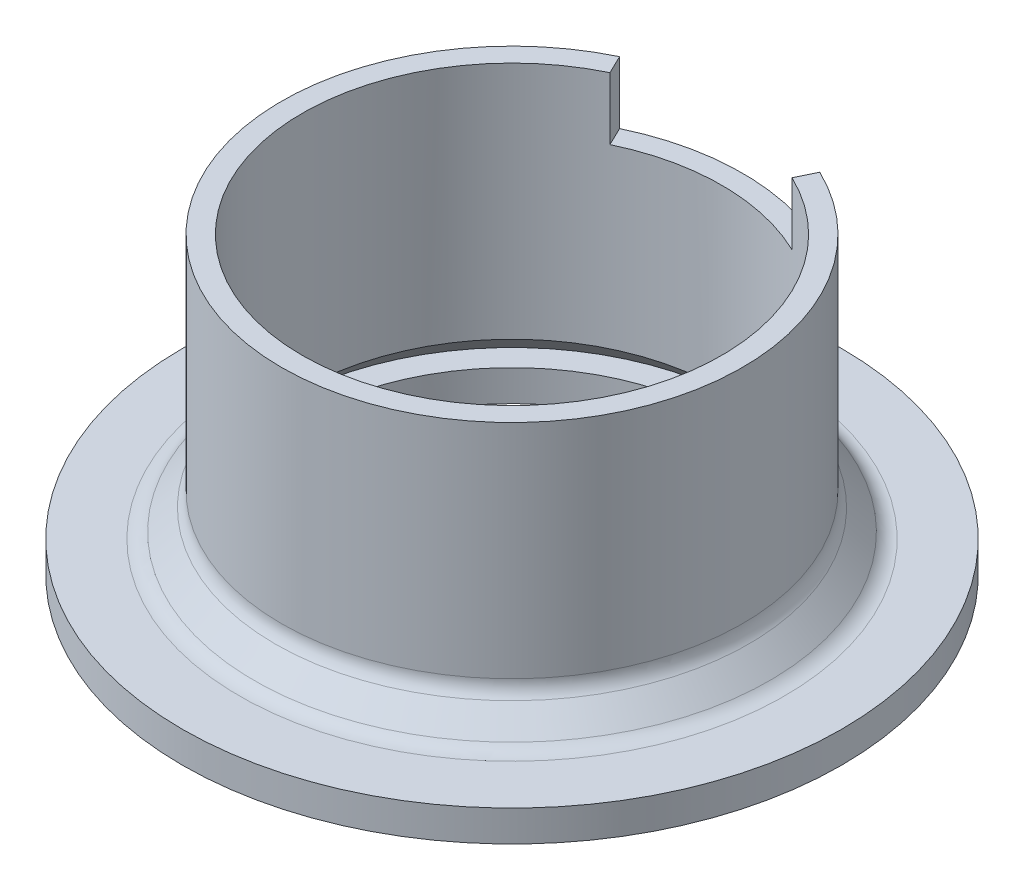
ISO-10303-21;
HEADER;
FILE_DESCRIPTION(('STEP AP214'),'2;1');
FILE_NAME('part.step','',(''),(''),'','','');
FILE_SCHEMA(('AUTOMOTIVE_DESIGN { 1 0 10303 214 1 1 1 1 }'));
ENDSEC;
DATA;
#1=APPLICATION_CONTEXT('core data for automotive mechanical design processes');
#2=APPLICATION_PROTOCOL_DEFINITION('international standard','automotive_design',2000,#1);
#3=PRODUCT_CONTEXT('',#1,'mechanical');
#4=PRODUCT('Part','Part','',(#3));
#5=PRODUCT_RELATED_PRODUCT_CATEGORY('part','',(#4));
#6=PRODUCT_DEFINITION_FORMATION('','',#4);
#7=PRODUCT_DEFINITION_CONTEXT('part definition',#1,'design');
#8=PRODUCT_DEFINITION('design','',#6,#7);
#9=PRODUCT_DEFINITION_SHAPE('','',#8);
#10=(LENGTH_UNIT() NAMED_UNIT(*) SI_UNIT(.MILLI.,.METRE.));
#11=(NAMED_UNIT(*) PLANE_ANGLE_UNIT() SI_UNIT($,.RADIAN.));
#12=(NAMED_UNIT(*) SI_UNIT($,.STERADIAN.) SOLID_ANGLE_UNIT());
#13=UNCERTAINTY_MEASURE_WITH_UNIT(LENGTH_MEASURE(1.E-05),#10,'distance_accuracy_value','');
#14=(GEOMETRIC_REPRESENTATION_CONTEXT(3) GLOBAL_UNCERTAINTY_ASSIGNED_CONTEXT((#13)) GLOBAL_UNIT_ASSIGNED_CONTEXT((#10,
#11,#12)) REPRESENTATION_CONTEXT('',''));
#15=CARTESIAN_POINT('',(0.,0.,0.));
#16=DIRECTION('',(0.,0.,1.));
#17=DIRECTION('',(1.,0.,0.));
#18=AXIS2_PLACEMENT_3D('',#15,#16,#17);
#19=CARTESIAN_POINT('',(0.,0.,0.));
#20=DIRECTION('',(0.,-1.,0.));
#21=DIRECTION('',(0.,0.,-1.));
#22=AXIS2_PLACEMENT_3D('',#19,#20,#21);
#23=CONICAL_SURFACE('',#22,22.5715728752538,0.785398163397448);
#24=CARTESIAN_POINT('',(0.,0.,0.));
#25=DIRECTION('',(0.,1.,0.));
#26=DIRECTION('',(0.,0.,1.));
#27=AXIS2_PLACEMENT_3D('',#24,#25,#26);
#28=CIRCLE('',#27,22.5715728752538);
#29=CARTESIAN_POINT('',(1.00000000000024,0.,22.5494102375848));
#30=VERTEX_POINT('',#29);
#31=CARTESIAN_POINT('',(22.5494102375848,0.,1.));
#32=VERTEX_POINT('',#31);
#33=EDGE_CURVE('E210',#30,#32,#28,.T.);
#34=ORIENTED_EDGE('',*,*,#33,.F.);
#35=CARTESIAN_POINT('',(1.00000000000027,-3.0926493253987,25.644732425285));
#36=CARTESIAN_POINT('',(1.00000000000026,-2.38144524293219,24.9329862035659));
#37=CARTESIAN_POINT('',(1.00000000000025,-1.67026202271059,24.2212191333853));
#38=CARTESIAN_POINT('',(1.00000000000024,-0.247954460315439,22.7976261871441));
#39=CARTESIAN_POINT('',(1.00000000000023,0.463169881858879,22.0858003110842));
#40=CARTESIAN_POINT('',(1.00000000000022,1.88534255816285,20.6620726205477));
#41=CARTESIAN_POINT('',(1.00000000000021,2.59639089229196,19.9501708060707));
#42=CARTESIAN_POINT('',(1.00000000000019,4.01837974852563,18.5262594934386));
#43=CARTESIAN_POINT('',(1.00000000000019,4.72932027062876,17.8142499952823));
#44=CARTESIAN_POINT('',(1.00000000000018,5.44019097783295,17.10217078956));
#45=B_SPLINE_CURVE_WITH_KNOTS('',3,(#35,#36,#37,#38,#39,#40,#41,#42,#43,#44),.UNSPECIFIED.,.F.,
.F.,(4,2,2,2,4),(0.,3.01853364877657,6.03706725821883,9.05560088899381,12.0741345597101),.UNSPECIFIED.);
#46=CARTESIAN_POINT('',(1.00000000000021,2.34683554692244,20.2));
#47=VERTEX_POINT('',#46);
#48=EDGE_CURVE('E462',#30,#47,#45,.T.);
#49=ORIENTED_EDGE('',*,*,#48,.T.);
#50=CARTESIAN_POINT('',(-6.5069413407723,1.34940791471657,20.2000000000001));
#51=CARTESIAN_POINT('',(-6.27177744659428,1.42151188061224,20.2000000000001));
#52=CARTESIAN_POINT('',(-6.035627758326,1.49037548259756,20.2000000000001));
#53=CARTESIAN_POINT('',(-5.56140065408711,1.62122178355149,20.2000000000001));
#54=CARTESIAN_POINT('',(-5.32332300692677,1.68320364378869,20.2000000000001));
#55=CARTESIAN_POINT('',(-4.60601502671594,1.85828278435188,20.2));
#56=CARTESIAN_POINT('',(-4.12403971023993,1.96041133415662,20.2));
#57=CARTESIAN_POINT('',(-3.16355454162542,2.1307071040694,20.2));
#58=CARTESIAN_POINT('',(-2.68515289396587,2.19948283286201,20.2));
#59=CARTESIAN_POINT('',(-1.72487503342651,2.30367834314739,20.2));
#60=CARTESIAN_POINT('',(-1.24300024462189,2.33911109036389,20.2));
#61=CARTESIAN_POINT('',(-0.277385611884381,2.37543620653485,20.2));
#62=CARTESIAN_POINT('',(0.206355732604704,2.37628912458079,20.2));
#63=CARTESIAN_POINT('',(1.17279146788919,2.34332329522053,20.2));
#64=CARTESIAN_POINT('',(1.65548546383504,2.30949319051694,20.2));
#65=CARTESIAN_POINT('',(2.62662851013934,2.20735054038173,20.2));
#66=CARTESIAN_POINT('',(3.1150090788247,2.13838571552495,20.2));
#67=CARTESIAN_POINT('',(3.84307622424172,2.0106377609058,20.2));
#68=CARTESIAN_POINT('',(4.08497087652045,1.96401572473394,20.2));
#69=CARTESIAN_POINT('',(4.56711753771044,1.86304800041714,20.2));
#70=CARTESIAN_POINT('',(4.8073697202366,1.80870314225827,20.2));
#71=CARTESIAN_POINT('',(5.04674065574689,1.75067973287477,20.1999999999999));
#72=B_SPLINE_CURVE_WITH_KNOTS('',3,(#50,#51,#52,#53,#54,#55,#56,#57,#58,#59,#60,#61,#62,#63,#64,
#65,#66,#67,#68,#69,#70,#71),.UNSPECIFIED.,.F.,.F.,(4,2,2,2,2,2,2,2,2,2,4),(0.,
0.737864513970868,1.47581885874038,2.95276251623984,4.40163875350358,5.8499513488727,
7.29991622660368,8.75035606131851,10.2287618292153,10.9676947858209,11.7065483879013),.UNSPECIFIED.);
#73=CARTESIAN_POINT('',(2.11583769133894E-13,2.37157287525381,20.2));
#74=VERTEX_POINT('',#73);
#75=EDGE_CURVE('E488',#74,#47,#72,.T.);
#76=ORIENTED_EDGE('',*,*,#75,.F.);
#77=CARTESIAN_POINT('',(0.,2.37157287525381,0.));
#78=DIRECTION('',(0.,1.,0.));
#79=DIRECTION('',(0.,0.,1.));
#80=AXIS2_PLACEMENT_3D('',#77,#78,#79);
#81=CIRCLE('',#80,20.2);
#82=CARTESIAN_POINT('',(20.2,2.37157287525381,0.));
#83=VERTEX_POINT('',#82);
#84=EDGE_CURVE('E215',#74,#83,#81,.T.);
#85=ORIENTED_EDGE('',*,*,#84,.T.);
#86=CARTESIAN_POINT('',(20.2,1.75067973287477,5.04674065574667));
#87=CARTESIAN_POINT('',(20.2,1.80870314225827,4.80736972023639));
#88=CARTESIAN_POINT('',(20.2,1.86304800041714,4.56711753771022));
#89=CARTESIAN_POINT('',(20.2,1.96401572473394,4.08497087652023));
#90=CARTESIAN_POINT('',(20.2,2.0106377609058,3.8430762242415));
#91=CARTESIAN_POINT('',(20.2,2.13838571552495,3.11500907882448));
#92=CARTESIAN_POINT('',(20.2,2.20735054038173,2.62662851013912));
#93=CARTESIAN_POINT('',(20.2,2.30949319051693,1.65548546383482));
#94=CARTESIAN_POINT('',(20.2,2.34332329522053,1.17279146788897));
#95=CARTESIAN_POINT('',(20.2,2.37628912458079,0.206355732604489));
#96=CARTESIAN_POINT('',(20.2,2.37543620653485,-0.277385611884596));
#97=CARTESIAN_POINT('',(20.2,2.33911109036389,-1.24300024462211));
#98=CARTESIAN_POINT('',(20.2,2.30367834314739,-1.72487503342673));
#99=CARTESIAN_POINT('',(20.2,2.19948283286201,-2.68515289396609));
#100=CARTESIAN_POINT('',(20.2,2.1307071040694,-3.16355454162564));
#101=CARTESIAN_POINT('',(20.2,1.96041133415662,-4.12403971024014));
#102=CARTESIAN_POINT('',(20.2,1.85828278435188,-4.60601502671615));
#103=CARTESIAN_POINT('',(20.2,1.68320364378869,-5.32332300692699));
#104=CARTESIAN_POINT('',(20.2,1.62122178355149,-5.56140065408732));
#105=CARTESIAN_POINT('',(20.2,1.49037548259757,-6.03562775832621));
#106=CARTESIAN_POINT('',(20.2,1.42151188061224,-6.27177744659449));
#107=CARTESIAN_POINT('',(20.2,1.34940791471657,-6.50694134077251));
#108=B_SPLINE_CURVE_WITH_KNOTS('',3,(#86,#87,#88,#89,#90,#91,#92,#93,#94,#95,#96,#97,#98,#99,
#100,#101,#102,#103,#104,#105,#106,#107),.UNSPECIFIED.,.F.,.F.,(4,2,2,2,2,2,2,2,2,2,4),(0.,
0.738853602080394,1.47778655868599,2.95619232658281,4.40663216129764,5.85659703902863,
7.30490963439775,8.75378587166148,10.2307295291609,10.9686838739305,11.7065483879013),.UNSPECIFIED.);
#109=CARTESIAN_POINT('',(20.2,2.34683554692244,1.));
#110=VERTEX_POINT('',#109);
#111=EDGE_CURVE('E241',#110,#83,#108,.T.);
#112=ORIENTED_EDGE('',*,*,#111,.F.);
#113=CARTESIAN_POINT('',(25.644732425285,-3.09264932539868,1.));
#114=CARTESIAN_POINT('',(24.9329862035659,-2.38144524293218,1.));
#115=CARTESIAN_POINT('',(24.2212191333853,-1.67026202271058,1.));
#116=CARTESIAN_POINT('',(22.7976261871441,-0.247954460315433,1.));
#117=CARTESIAN_POINT('',(22.0858003110842,0.463169881858883,1.));
#118=CARTESIAN_POINT('',(20.6620726205477,1.88534255816285,1.));
#119=CARTESIAN_POINT('',(19.9501708060707,2.59639089229196,1.));
#120=CARTESIAN_POINT('',(18.5262594934387,4.01837974852563,1.));
#121=CARTESIAN_POINT('',(17.8142499952823,4.72932027062875,1.));
#122=CARTESIAN_POINT('',(17.10217078956,5.44019097783294,1.));
#123=B_SPLINE_CURVE_WITH_KNOTS('',3,(#113,#114,#115,#116,#117,#118,#119,#120,#121,#122),
.UNSPECIFIED.,.F.,.F.,(4,2,2,2,4),(0.,3.01853364877657,6.03706725821882,9.05560088899379,
12.0741345597101),.UNSPECIFIED.);
#124=EDGE_CURVE('E396',#32,#110,#123,.T.);
#125=ORIENTED_EDGE('',*,*,#124,.F.);
#126=EDGE_LOOP('',(#34,#49,#76,#85,#112,#125));
#127=FACE_BOUND('',#126,.T.);
#128=ADVANCED_FACE('F35',(#127),#23,.F.);
#129=CARTESIAN_POINT('',(0.,0.,0.));
#130=DIRECTION('',(0.,-1.,0.));
#131=DIRECTION('',(0.,0.,-1.));
#132=AXIS2_PLACEMENT_3D('',#129,#130,#131);
#133=PLANE('',#132);
#134=DIRECTION('',(0.,0.,1.));
#135=VECTOR('',#134,1.);
#136=CARTESIAN_POINT('',(1.00000000000021,0.,20.2));
#137=LINE('',#136,#135);
#138=CARTESIAN_POINT('',(1.00000000000021,0.,20.2));
#139=VERTEX_POINT('',#138);
#140=EDGE_CURVE('E496',#139,#30,#137,.T.);
#141=ORIENTED_EDGE('',*,*,#140,.T.);
#142=ORIENTED_EDGE('',*,*,#33,.T.);
#143=DIRECTION('',(1.,0.,0.));
#144=VECTOR('',#143,1.);
#145=CARTESIAN_POINT('',(20.2,0.,1.));
#146=LINE('',#145,#144);
#147=CARTESIAN_POINT('',(20.2,0.,1.));
#148=VERTEX_POINT('',#147);
#149=EDGE_CURVE('E385',#148,#32,#146,.T.);
#150=ORIENTED_EDGE('',*,*,#149,.F.);
#151=DIRECTION('',(0.,0.,1.));
#152=VECTOR('',#151,1.);
#153=CARTESIAN_POINT('',(20.2,0.,-1.));
#154=LINE('',#153,#152);
#155=CARTESIAN_POINT('',(20.2,0.,0.));
#156=VERTEX_POINT('',#155);
#157=EDGE_CURVE('E393',#156,#148,#154,.T.);
#158=ORIENTED_EDGE('',*,*,#157,.F.);
#159=CARTESIAN_POINT('',(0.,0.,0.));
#160=DIRECTION('',(0.,-1.,0.));
#161=DIRECTION('',(0.,0.,-1.));
#162=AXIS2_PLACEMENT_3D('',#159,#160,#161);
#163=CIRCLE('',#162,20.2);
#164=CARTESIAN_POINT('',(2.11583769133894E-13,0.,20.2));
#165=VERTEX_POINT('',#164);
#166=EDGE_CURVE('E227',#156,#165,#163,.T.);
#167=ORIENTED_EDGE('',*,*,#166,.T.);
#168=DIRECTION('',(-1.,0.,0.));
#169=VECTOR('',#168,1.);
#170=CARTESIAN_POINT('',(1.00000000000021,0.,20.2));
#171=LINE('',#170,#169);
#172=EDGE_CURVE('E494',#139,#165,#171,.T.);
#173=ORIENTED_EDGE('',*,*,#172,.F.);
#174=EDGE_LOOP('',(#141,#142,#150,#158,#167,#173));
#175=FACE_BOUND('',#174,.T.);
#176=ADVANCED_FACE('F275',(#175),#133,.F.);
#177=CARTESIAN_POINT('',(-0.999999999999788,2.34683554692244,20.2));
#178=VERTEX_POINT('',#177);
#179=EDGE_CURVE('E493',#178,#74,#72,.T.);
#180=ORIENTED_EDGE('',*,*,#179,.F.);
#181=CARTESIAN_POINT('',(-0.999999999999731,-3.09264932539868,25.644732425285));
#182=CARTESIAN_POINT('',(-0.999999999999739,-2.38144524293217,24.9329862035659));
#183=CARTESIAN_POINT('',(-0.999999999999746,-1.67026202271058,24.2212191333854));
#184=CARTESIAN_POINT('',(-0.999999999999761,-0.24795446031543,22.7976261871441));
#185=CARTESIAN_POINT('',(-0.999999999999769,0.463169881858885,22.0858003110842));
#186=CARTESIAN_POINT('',(-0.999999999999783,1.88534255816285,20.6620726205477));
#187=CARTESIAN_POINT('',(-0.999999999999791,2.59639089229196,19.9501708060707));
#188=CARTESIAN_POINT('',(-0.999999999999806,4.01837974852562,18.5262594934387));
#189=CARTESIAN_POINT('',(-0.999999999999813,4.72932027062875,17.8142499952823));
#190=CARTESIAN_POINT('',(-0.999999999999821,5.44019097783294,17.10217078956));
#191=B_SPLINE_CURVE_WITH_KNOTS('',3,(#181,#182,#183,#184,#185,#186,#187,#188,#189,#190),
.UNSPECIFIED.,.F.,.F.,(4,2,2,2,4),(0.,3.01853364877656,6.03706725821881,9.05560088899377,
12.0741345597101),.UNSPECIFIED.);
#192=CARTESIAN_POINT('',(-0.999999999999764,0.,22.5494102375848));
#193=VERTEX_POINT('',#192);
#194=EDGE_CURVE('E469',#193,#178,#191,.T.);
#195=ORIENTED_EDGE('',*,*,#194,.F.);
#196=CARTESIAN_POINT('',(-22.5494102375848,0.,1.));
#197=VERTEX_POINT('',#196);
#198=EDGE_CURVE('E444',#197,#193,#28,.T.);
#199=ORIENTED_EDGE('',*,*,#198,.F.);
#200=CARTESIAN_POINT('',(-26.5345643924501,-3.98182817804029,1.));
#201=CARTESIAN_POINT('',(-25.8228361059004,-3.27060615055294,1.));
#202=CARTESIAN_POINT('',(-25.111088892155,-2.55940306206986,1.));
#203=CARTESIAN_POINT('',(-23.6875418845975,-1.13704952407763,1.));
#204=CARTESIAN_POINT('',(-22.975742090786,-0.425899074567931,1.));
#205=CARTESIAN_POINT('',(-21.5520751792395,0.996334442681487,1.));
#206=CARTESIAN_POINT('',(-20.8402080615041,1.70741751042085,1.));
#207=CARTESIAN_POINT('',(-19.4163798851905,3.12948960250176,1.));
#208=CARTESIAN_POINT('',(-18.7044188266114,3.84047862684233,1.));
#209=CARTESIAN_POINT('',(-17.9923974945828,4.55140729324345,1.));
#210=B_SPLINE_CURVE_WITH_KNOTS('',3,(#200,#201,#202,#203,#204,#205,#206,#207,#208,#209),
.UNSPECIFIED.,.F.,.F.,(4,2,2,2,4),(0.,3.01853364130784,6.03706725202868,9.05560087868852,
12.0741345363519),.UNSPECIFIED.);
#211=CARTESIAN_POINT('',(-20.2,2.34683554692244,1.));
#212=VERTEX_POINT('',#211);
#213=EDGE_CURVE('E334',#197,#212,#210,.T.);
#214=ORIENTED_EDGE('',*,*,#213,.T.);
#215=CARTESIAN_POINT('',(-20.2,1.34940791471657,-6.50694134077251));
#216=CARTESIAN_POINT('',(-20.2,1.42151188061224,-6.27177744659449));
#217=CARTESIAN_POINT('',(-20.2,1.49037548259757,-6.03562775832621));
#218=CARTESIAN_POINT('',(-20.2,1.62122178355149,-5.56140065408732));
#219=CARTESIAN_POINT('',(-20.2,1.68320364378869,-5.32332300692699));
#220=CARTESIAN_POINT('',(-20.2,1.85828278435188,-4.60601502671615));
#221=CARTESIAN_POINT('',(-20.2,1.96041133415662,-4.12403971024014));
#222=CARTESIAN_POINT('',(-20.2,2.1307071040694,-3.16355454162564));
#223=CARTESIAN_POINT('',(-20.2,2.19948283286201,-2.68515289396608));
#224=CARTESIAN_POINT('',(-20.2,2.30367834314739,-1.72487503342673));
#225=CARTESIAN_POINT('',(-20.2,2.33911109036389,-1.2430002446221));
#226=CARTESIAN_POINT('',(-20.2,2.37543620653485,-0.277385611884593));
#227=CARTESIAN_POINT('',(-20.2,2.37628912458079,0.206355732604492));
#228=CARTESIAN_POINT('',(-20.2,2.34332329522053,1.17279146788898));
#229=CARTESIAN_POINT('',(-20.2,2.30949319051694,1.65548546383483));
#230=CARTESIAN_POINT('',(-20.2,2.20735054038173,2.62662851013912));
#231=CARTESIAN_POINT('',(-20.2,2.13838571552495,3.11500907882448));
#232=CARTESIAN_POINT('',(-20.2,2.0106377609058,3.8430762242415));
#233=CARTESIAN_POINT('',(-20.2,1.96401572473394,4.08497087652023));
#234=CARTESIAN_POINT('',(-20.2,1.86304800041714,4.56711753771022));
#235=CARTESIAN_POINT('',(-20.2,1.80870314225827,4.80736972023639));
#236=CARTESIAN_POINT('',(-20.2,1.75067973287477,5.04674065574667));
#237=B_SPLINE_CURVE_WITH_KNOTS('',3,(#215,#216,#217,#218,#219,#220,#221,#222,#223,#224,#225,
#226,#227,#228,#229,#230,#231,#232,#233,#234,#235,#236),.UNSPECIFIED.,.F.,.F.,(4,2,2,2,2,2,2,2,
2,2,4),(0.,0.737864513970868,1.47581885874038,2.95276251623984,4.40163875350357,5.8499513488727,
7.29991622660368,8.75035606131851,10.2287618292153,10.9676947858209,11.7065483879013),.UNSPECIFIED.);
#238=CARTESIAN_POINT('',(-20.2,2.37157287525381,0.));
#239=VERTEX_POINT('',#238);
#240=EDGE_CURVE('E332',#239,#212,#237,.T.);
#241=ORIENTED_EDGE('',*,*,#240,.F.);
#242=EDGE_CURVE('E534',#239,#74,#81,.T.);
#243=ORIENTED_EDGE('',*,*,#242,.T.);
#244=EDGE_LOOP('',(#180,#195,#199,#214,#241,#243));
#245=FACE_BOUND('',#244,.T.);
#246=ADVANCED_FACE('F296',(#245),#23,.F.);
#247=DIRECTION('',(0.,0.,1.));
#248=VECTOR('',#247,1.);
#249=CARTESIAN_POINT('',(-0.999999999999788,0.,20.2));
#250=LINE('',#249,#248);
#251=CARTESIAN_POINT('',(-0.999999999999788,0.,20.2));
#252=VERTEX_POINT('',#251);
#253=EDGE_CURVE('E501',#252,#193,#250,.T.);
#254=ORIENTED_EDGE('',*,*,#253,.F.);
#255=EDGE_CURVE('E56',#165,#252,#171,.T.);
#256=ORIENTED_EDGE('',*,*,#255,.F.);
#257=CARTESIAN_POINT('',(-20.2,0.,0.));
#258=VERTEX_POINT('',#257);
#259=EDGE_CURVE('E230',#165,#258,#163,.T.);
#260=ORIENTED_EDGE('',*,*,#259,.T.);
#261=DIRECTION('',(0.,0.,-1.));
#262=VECTOR('',#261,1.);
#263=CARTESIAN_POINT('',(-20.2,0.,1.));
#264=LINE('',#263,#262);
#265=CARTESIAN_POINT('',(-20.2,0.,1.));
#266=VERTEX_POINT('',#265);
#267=EDGE_CURVE('E336',#266,#258,#264,.T.);
#268=ORIENTED_EDGE('',*,*,#267,.F.);
#269=DIRECTION('',(-1.,0.,0.));
#270=VECTOR('',#269,1.);
#271=CARTESIAN_POINT('',(-20.2,0.,1.));
#272=LINE('',#271,#270);
#273=EDGE_CURVE('E449',#266,#197,#272,.T.);
#274=ORIENTED_EDGE('',*,*,#273,.T.);
#275=ORIENTED_EDGE('',*,*,#198,.T.);
#276=EDGE_LOOP('',(#254,#256,#260,#268,#274,#275));
#277=FACE_BOUND('',#276,.T.);
#278=ADVANCED_FACE('F301',(#277),#133,.F.);
#279=CARTESIAN_POINT('',(-20.2,2.34683554692244,-1.));
#280=VERTEX_POINT('',#279);
#281=EDGE_CURVE('E323',#280,#239,#237,.T.);
#282=ORIENTED_EDGE('',*,*,#281,.F.);
#283=CARTESIAN_POINT('',(-26.5345643924501,-3.98182817804029,-1.));
#284=CARTESIAN_POINT('',(-25.8228361059004,-3.27060615055294,-1.));
#285=CARTESIAN_POINT('',(-25.111088892155,-2.55940306206986,-1.));
#286=CARTESIAN_POINT('',(-23.6875418845975,-1.13704952407763,-1.));
#287=CARTESIAN_POINT('',(-22.975742090786,-0.425899074567931,-1.));
#288=CARTESIAN_POINT('',(-21.5520751792395,0.996334442681487,-1.));
#289=CARTESIAN_POINT('',(-20.8402080615041,1.70741751042085,-1.));
#290=CARTESIAN_POINT('',(-19.4163798851905,3.12948960250176,-1.));
#291=CARTESIAN_POINT('',(-18.7044188266114,3.84047862684233,-1.));
#292=CARTESIAN_POINT('',(-17.9923974945828,4.55140729324345,-1.));
#293=B_SPLINE_CURVE_WITH_KNOTS('',3,(#283,#284,#285,#286,#287,#288,#289,#290,#291,#292),
.UNSPECIFIED.,.F.,.F.,(4,2,2,2,4),(0.,3.01853364130784,6.03706725202868,9.05560087868852,
12.0741345363519),.UNSPECIFIED.);
#294=CARTESIAN_POINT('',(-22.5494102375848,0.,-1.));
#295=VERTEX_POINT('',#294);
#296=EDGE_CURVE('E325',#295,#280,#293,.T.);
#297=ORIENTED_EDGE('',*,*,#296,.F.);
#298=CARTESIAN_POINT('',(-1.00000000000008,0.,-22.5494102375848));
#299=VERTEX_POINT('',#298);
#300=EDGE_CURVE('E209',#299,#295,#28,.T.);
#301=ORIENTED_EDGE('',*,*,#300,.F.);
#302=CARTESIAN_POINT('',(-1.00000000000009,-3.98182817804029,-26.5345643924501));
#303=CARTESIAN_POINT('',(-1.00000000000009,-3.27060615055294,-25.8228361059004));
#304=CARTESIAN_POINT('',(-1.00000000000009,-2.55940306206987,-25.1110888921549));
#305=CARTESIAN_POINT('',(-1.00000000000008,-1.13704952407763,-23.6875418845975));
#306=CARTESIAN_POINT('',(-1.00000000000008,-0.425899074567931,-22.975742090786));
#307=CARTESIAN_POINT('',(-1.00000000000008,0.996334442681486,-21.5520751792395));
#308=CARTESIAN_POINT('',(-1.00000000000007,1.70741751042085,-20.8402080615041));
#309=CARTESIAN_POINT('',(-1.00000000000007,3.12948960250175,-19.4163798851905));
#310=CARTESIAN_POINT('',(-1.00000000000007,3.84047862684233,-18.7044188266114));
#311=CARTESIAN_POINT('',(-1.00000000000006,4.55140729324345,-17.9923974945828));
#312=B_SPLINE_CURVE_WITH_KNOTS('',3,(#302,#303,#304,#305,#306,#307,#308,#309,#310,#311),
.UNSPECIFIED.,.F.,.F.,(4,2,2,2,4),(0.,3.01853364130784,6.03706725202869,9.05560087868852,
12.0741345363519),.UNSPECIFIED.);
#313=CARTESIAN_POINT('',(-1.00000000000007,2.34683554692244,-20.2));
#314=VERTEX_POINT('',#313);
#315=EDGE_CURVE('E370',#299,#314,#312,.T.);
#316=ORIENTED_EDGE('',*,*,#315,.T.);
#317=CARTESIAN_POINT('',(5.0467406557466,1.75067973287477,-20.2));
#318=CARTESIAN_POINT('',(4.80736972023632,1.80870314225826,-20.2));
#319=CARTESIAN_POINT('',(4.56711753771015,1.86304800041714,-20.2));
#320=CARTESIAN_POINT('',(4.08497087652016,1.96401572473394,-20.2));
#321=CARTESIAN_POINT('',(3.84307622424143,2.0106377609058,-20.2));
#322=CARTESIAN_POINT('',(3.11500907882441,2.13838571552495,-20.2));
#323=CARTESIAN_POINT('',(2.62662851013905,2.20735054038173,-20.2));
#324=CARTESIAN_POINT('',(1.65548546383475,2.30949319051693,-20.2));
#325=CARTESIAN_POINT('',(1.1727914678889,2.34332329522053,-20.2));
#326=CARTESIAN_POINT('',(0.206355732604418,2.37628912458079,-20.2));
#327=CARTESIAN_POINT('',(-0.277385611884667,2.37543620653485,-20.2));
#328=CARTESIAN_POINT('',(-1.24300024462218,2.33911109036389,-20.2));
#329=CARTESIAN_POINT('',(-1.7248750334268,2.30367834314739,-20.2));
#330=CARTESIAN_POINT('',(-2.68515289396616,2.19948283286201,-20.2));
#331=CARTESIAN_POINT('',(-3.16355454162571,2.1307071040694,-20.2));
#332=CARTESIAN_POINT('',(-4.12403971024021,1.96041133415662,-20.2));
#333=CARTESIAN_POINT('',(-4.60601502671622,1.85828278435188,-20.2));
#334=CARTESIAN_POINT('',(-5.32332300692705,1.68320364378869,-20.2));
#335=CARTESIAN_POINT('',(-5.56140065408739,1.62122178355149,-20.2));
#336=CARTESIAN_POINT('',(-6.03562775832628,1.49037548259756,-20.2));
#337=CARTESIAN_POINT('',(-6.27177744659457,1.42151188061224,-20.2));
#338=CARTESIAN_POINT('',(-6.50694134077258,1.34940791471657,-20.2));
#339=B_SPLINE_CURVE_WITH_KNOTS('',3,(#317,#318,#319,#320,#321,#322,#323,#324,#325,#326,#327,
#328,#329,#330,#331,#332,#333,#334,#335,#336,#337,#338),.UNSPECIFIED.,.F.,.F.,(4,2,2,2,2,2,2,2,
2,2,4),(0.,0.738853602080395,1.47778655868599,2.95619232658281,4.40663216129764,
5.85659703902863,7.30490963439775,8.75378587166148,10.2307295291609,10.9686838739305,
11.7065483879013),.UNSPECIFIED.);
#340=CARTESIAN_POINT('',(0.,2.37157287525381,-20.2));
#341=VERTEX_POINT('',#340);
#342=EDGE_CURVE('E372',#341,#314,#339,.T.);
#343=ORIENTED_EDGE('',*,*,#342,.F.);
#344=EDGE_CURVE('E214',#341,#239,#81,.T.);
#345=ORIENTED_EDGE('',*,*,#344,.T.);
#346=EDGE_LOOP('',(#282,#297,#301,#316,#343,#345));
#347=FACE_BOUND('',#346,.T.);
#348=ADVANCED_FACE('F305',(#347),#23,.F.);
#349=DIRECTION('',(-1.,0.,0.));
#350=VECTOR('',#349,1.);
#351=CARTESIAN_POINT('',(-20.2,0.,-1.));
#352=LINE('',#351,#350);
#353=CARTESIAN_POINT('',(-20.2,0.,-1.));
#354=VERTEX_POINT('',#353);
#355=EDGE_CURVE('E455',#354,#295,#352,.T.);
#356=ORIENTED_EDGE('',*,*,#355,.F.);
#357=EDGE_CURVE('E454',#258,#354,#264,.T.);
#358=ORIENTED_EDGE('',*,*,#357,.F.);
#359=CARTESIAN_POINT('',(0.,0.,-20.2));
#360=VERTEX_POINT('',#359);
#361=EDGE_CURVE('E545',#258,#360,#163,.T.);
#362=ORIENTED_EDGE('',*,*,#361,.T.);
#363=DIRECTION('',(1.,0.,0.));
#364=VECTOR('',#363,1.);
#365=CARTESIAN_POINT('',(-1.00000000000007,0.,-20.2));
#366=LINE('',#365,#364);
#367=CARTESIAN_POINT('',(-1.00000000000007,0.,-20.2));
#368=VERTEX_POINT('',#367);
#369=EDGE_CURVE('E425',#368,#360,#366,.T.);
#370=ORIENTED_EDGE('',*,*,#369,.F.);
#371=DIRECTION('',(0.,0.,-1.));
#372=VECTOR('',#371,1.);
#373=CARTESIAN_POINT('',(-1.00000000000007,0.,-20.2));
#374=LINE('',#373,#372);
#375=EDGE_CURVE('E428',#368,#299,#374,.T.);
#376=ORIENTED_EDGE('',*,*,#375,.T.);
#377=ORIENTED_EDGE('',*,*,#300,.T.);
#378=EDGE_LOOP('',(#356,#358,#362,#370,#376,#377));
#379=FACE_BOUND('',#378,.T.);
#380=ADVANCED_FACE('F307',(#379),#133,.F.);
#381=CARTESIAN_POINT('',(0.99999999999993,2.34683554692244,-20.2));
#382=VERTEX_POINT('',#381);
#383=EDGE_CURVE('E371',#382,#341,#339,.T.);
#384=ORIENTED_EDGE('',*,*,#383,.F.);
#385=CARTESIAN_POINT('',(0.999999999999907,-3.98182817804028,-26.5345643924501));
#386=CARTESIAN_POINT('',(0.99999999999991,-3.27060615055293,-25.8228361059004));
#387=CARTESIAN_POINT('',(0.999999999999912,-2.55940306206986,-25.1110888921549));
#388=CARTESIAN_POINT('',(0.999999999999917,-1.13704952407762,-23.6875418845975));
#389=CARTESIAN_POINT('',(0.99999999999992,-0.425899074567926,-22.975742090786));
#390=CARTESIAN_POINT('',(0.999999999999925,0.996334442681492,-21.5520751792395));
#391=CARTESIAN_POINT('',(0.999999999999927,1.70741751042086,-20.8402080615041));
#392=CARTESIAN_POINT('',(0.999999999999932,3.12948960250176,-19.4163798851905));
#393=CARTESIAN_POINT('',(0.999999999999935,3.84047862684233,-18.7044188266114));
#394=CARTESIAN_POINT('',(0.999999999999937,4.55140729324345,-17.9923974945828));
#395=B_SPLINE_CURVE_WITH_KNOTS('',3,(#385,#386,#387,#388,#389,#390,#391,#392,#393,#394),
.UNSPECIFIED.,.F.,.F.,(4,2,2,2,4),(0.,3.01853364130784,6.03706725202868,9.05560087868852,
12.0741345363519),.UNSPECIFIED.);
#396=CARTESIAN_POINT('',(0.999999999999921,0.,-22.5494102375848));
#397=VERTEX_POINT('',#396);
#398=EDGE_CURVE('E364',#397,#382,#395,.T.);
#399=ORIENTED_EDGE('',*,*,#398,.F.);
#400=CARTESIAN_POINT('',(22.5494102375848,0.,-1.));
#401=VERTEX_POINT('',#400);
#402=EDGE_CURVE('E206',#401,#397,#28,.T.);
#403=ORIENTED_EDGE('',*,*,#402,.F.);
#404=CARTESIAN_POINT('',(25.644732425285,-3.09264932539868,-1.));
#405=CARTESIAN_POINT('',(24.9329862035659,-2.38144524293218,-1.));
#406=CARTESIAN_POINT('',(24.2212191333853,-1.67026202271058,-1.));
#407=CARTESIAN_POINT('',(22.7976261871441,-0.247954460315433,-1.));
#408=CARTESIAN_POINT('',(22.0858003110842,0.463169881858883,-1.));
#409=CARTESIAN_POINT('',(20.6620726205477,1.88534255816285,-1.));
#410=CARTESIAN_POINT('',(19.9501708060707,2.59639089229196,-1.));
#411=CARTESIAN_POINT('',(18.5262594934387,4.01837974852563,-1.));
#412=CARTESIAN_POINT('',(17.8142499952823,4.72932027062875,-1.));
#413=CARTESIAN_POINT('',(17.10217078956,5.44019097783294,-1.));
#414=B_SPLINE_CURVE_WITH_KNOTS('',3,(#404,#405,#406,#407,#408,#409,#410,#411,#412,#413),
.UNSPECIFIED.,.F.,.F.,(4,2,2,2,4),(0.,3.01853364877657,6.03706725821882,9.05560088899379,
12.0741345597101),.UNSPECIFIED.);
#415=CARTESIAN_POINT('',(20.2,2.34683554692244,-1.));
#416=VERTEX_POINT('',#415);
#417=EDGE_CURVE('E242',#401,#416,#414,.T.);
#418=ORIENTED_EDGE('',*,*,#417,.T.);
#419=EDGE_CURVE('E234',#83,#416,#108,.T.);
#420=ORIENTED_EDGE('',*,*,#419,.F.);
#421=EDGE_CURVE('E211',#83,#341,#81,.T.);
#422=ORIENTED_EDGE('',*,*,#421,.T.);
#423=EDGE_LOOP('',(#384,#399,#403,#418,#420,#422));
#424=FACE_BOUND('',#423,.T.);
#425=ADVANCED_FACE('F248',(#424),#23,.F.);
#426=DIRECTION('',(0.,0.,-1.));
#427=VECTOR('',#426,1.);
#428=CARTESIAN_POINT('',(0.99999999999993,0.,-20.2));
#429=LINE('',#428,#427);
#430=CARTESIAN_POINT('',(0.99999999999993,0.,-20.2));
#431=VERTEX_POINT('',#430);
#432=EDGE_CURVE('E419',#431,#397,#429,.T.);
#433=ORIENTED_EDGE('',*,*,#432,.F.);
#434=EDGE_CURVE('E417',#360,#431,#366,.T.);
#435=ORIENTED_EDGE('',*,*,#434,.F.);
#436=EDGE_CURVE('E231',#360,#156,#163,.T.);
#437=ORIENTED_EDGE('',*,*,#436,.T.);
#438=CARTESIAN_POINT('',(20.2,0.,-1.));
#439=VERTEX_POINT('',#438);
#440=EDGE_CURVE('E394',#439,#156,#154,.T.);
#441=ORIENTED_EDGE('',*,*,#440,.F.);
#442=DIRECTION('',(1.,0.,0.));
#443=VECTOR('',#442,1.);
#444=CARTESIAN_POINT('',(20.2,0.,-1.));
#445=LINE('',#444,#443);
#446=EDGE_CURVE('E390',#439,#401,#445,.T.);
#447=ORIENTED_EDGE('',*,*,#446,.T.);
#448=ORIENTED_EDGE('',*,*,#402,.T.);
#449=EDGE_LOOP('',(#433,#435,#437,#441,#447,#448));
#450=FACE_BOUND('',#449,.T.);
#451=ADVANCED_FACE('F270',(#450),#133,.F.);
#452=CARTESIAN_POINT('',(0.,25.4,0.));
#453=DIRECTION('',(0.,1.,0.));
#454=DIRECTION('',(0.,0.,1.));
#455=AXIS2_PLACEMENT_3D('',#452,#453,#454);
#456=CYLINDRICAL_SURFACE('',#455,20.2);
#457=CARTESIAN_POINT('',(0.,19.4,0.));
#458=DIRECTION('',(0.,1.,0.));
#459=DIRECTION('',(0.,0.,1.));
#460=AXIS2_PLACEMENT_3D('',#457,#458,#459);
#461=CIRCLE('',#460,20.2);
#462=CARTESIAN_POINT('',(-8.76730188479305,19.4,-18.1981981981982));
#463=VERTEX_POINT('',#462);
#464=CARTESIAN_POINT('',(8.76730188479307,19.4,-18.1981981981982));
#465=VERTEX_POINT('',#464);
#466=EDGE_CURVE('E505',#463,#465,#461,.F.);
#467=ORIENTED_EDGE('',*,*,#466,.F.);
#468=DIRECTION('',(0.,1.,0.));
#469=VECTOR('',#468,1.);
#470=CARTESIAN_POINT('',(-8.76730188479306,25.4,-18.1981981981982));
#471=LINE('',#470,#469);
#472=CARTESIAN_POINT('',(-8.76730188479306,25.4,-18.1981981981982));
#473=VERTEX_POINT('',#472);
#474=EDGE_CURVE('E178',#463,#473,#471,.T.);
#475=ORIENTED_EDGE('',*,*,#474,.T.);
#476=CARTESIAN_POINT('',(0.,25.4,0.));
#477=DIRECTION('',(0.,1.,0.));
#478=DIRECTION('',(0.,0.,1.));
#479=AXIS2_PLACEMENT_3D('',#476,#477,#478);
#480=CIRCLE('',#479,20.2);
#481=CARTESIAN_POINT('',(8.76730188479307,25.4,-18.1981981981982));
#482=VERTEX_POINT('',#481);
#483=EDGE_CURVE('E216',#473,#482,#480,.T.);
#484=ORIENTED_EDGE('',*,*,#483,.T.);
#485=DIRECTION('',(0.,1.,0.));
#486=VECTOR('',#485,1.);
#487=CARTESIAN_POINT('',(8.76730188479307,25.4,-18.1981981981982));
#488=LINE('',#487,#486);
#489=EDGE_CURVE('E507',#482,#465,#488,.F.);
#490=ORIENTED_EDGE('',*,*,#489,.T.);
#491=EDGE_LOOP('',(#467,#475,#484,#490));
#492=FACE_BOUND('',#491,.T.);
#493=ORIENTED_EDGE('',*,*,#84,.F.);
#494=ORIENTED_EDGE('',*,*,#242,.F.);
#495=ORIENTED_EDGE('',*,*,#344,.F.);
#496=ORIENTED_EDGE('',*,*,#421,.F.);
#497=EDGE_LOOP('',(#493,#494,#495,#496));
#498=FACE_BOUND('',#497,.T.);
#499=ADVANCED_FACE('F273',(#492,#498),#456,.F.);
#500=CARTESIAN_POINT('',(-12.7,25.4,0.));
#501=DIRECTION('',(0.,-1.,0.));
#502=DIRECTION('',(0.,0.,-1.));
#503=AXIS2_PLACEMENT_3D('',#500,#501,#502);
#504=PLANE('',#503);
#505=ORIENTED_EDGE('',*,*,#483,.F.);
#506=DIRECTION('',(0.434024845781835,0.,0.900900900900901));
#507=VECTOR('',#506,1.);
#508=CARTESIAN_POINT('',(-7.75318869812615,25.4,-16.0932139044121));
#509=LINE('',#508,#507);
#510=CARTESIAN_POINT('',(-9.63535157635672,25.4,-20.));
#511=VERTEX_POINT('',#510);
#512=EDGE_CURVE('E512',#511,#473,#509,.T.);
#513=ORIENTED_EDGE('',*,*,#512,.F.);
#514=CARTESIAN_POINT('',(0.,25.4,0.));
#515=DIRECTION('',(0.,1.,0.));
#516=DIRECTION('',(0.,0.,1.));
#517=AXIS2_PLACEMENT_3D('',#514,#515,#516);
#518=CIRCLE('',#517,22.2);
#519=CARTESIAN_POINT('',(9.63535157635675,25.4,-20.));
#520=VERTEX_POINT('',#519);
#521=EDGE_CURVE('E193',#511,#520,#518,.T.);
#522=ORIENTED_EDGE('',*,*,#521,.T.);
#523=DIRECTION('',(0.434024845781835,0.,-0.900900900900901));
#524=VECTOR('',#523,1.);
#525=CARTESIAN_POINT('',(9.63535157635675,25.4,-20.));
#526=LINE('',#525,#524);
#527=EDGE_CURVE('E181',#482,#520,#526,.T.);
#528=ORIENTED_EDGE('',*,*,#527,.F.);
#529=EDGE_LOOP('',(#505,#513,#522,#528));
#530=FACE_BOUND('',#529,.T.);
#531=ADVANCED_FACE('F285',(#530),#504,.F.);
#532=CARTESIAN_POINT('',(0.,25.4,0.));
#533=DIRECTION('',(0.,1.,0.));
#534=DIRECTION('',(0.,0.,1.));
#535=AXIS2_PLACEMENT_3D('',#532,#533,#534);
#536=CYLINDRICAL_SURFACE('',#535,22.2);
#537=DIRECTION('',(0.,1.,0.));
#538=VECTOR('',#537,1.);
#539=CARTESIAN_POINT('',(9.63535157635675,25.4,-20.));
#540=LINE('',#539,#538);
#541=CARTESIAN_POINT('',(9.63535157635672,19.4,-20.));
#542=VERTEX_POINT('',#541);
#543=EDGE_CURVE('E11',#520,#542,#540,.F.);
#544=ORIENTED_EDGE('',*,*,#543,.F.);
#545=ORIENTED_EDGE('',*,*,#521,.F.);
#546=DIRECTION('',(0.,1.,0.));
#547=VECTOR('',#546,1.);
#548=CARTESIAN_POINT('',(-9.63535157635672,25.4,-20.));
#549=LINE('',#548,#547);
#550=CARTESIAN_POINT('',(-9.63535157635672,19.4,-20.));
#551=VERTEX_POINT('',#550);
#552=EDGE_CURVE('E43',#551,#511,#549,.T.);
#553=ORIENTED_EDGE('',*,*,#552,.F.);
#554=CARTESIAN_POINT('',(0.,19.4,0.));
#555=DIRECTION('',(0.,1.,0.));
#556=DIRECTION('',(0.,0.,1.));
#557=AXIS2_PLACEMENT_3D('',#554,#555,#556);
#558=CIRCLE('',#557,22.2);
#559=EDGE_CURVE('E184',#551,#542,#558,.F.);
#560=ORIENTED_EDGE('',*,*,#559,.T.);
#561=EDGE_LOOP('',(#544,#545,#553,#560));
#562=FACE_BOUND('',#561,.T.);
#563=CARTESIAN_POINT('',(0.,4.02842712474616,0.));
#564=DIRECTION('',(0.,1.,0.));
#565=DIRECTION('',(0.,0.,1.));
#566=AXIS2_PLACEMENT_3D('',#563,#564,#565);
#567=CIRCLE('',#566,22.2);
#568=CARTESIAN_POINT('',(0.,4.02842712474616,22.2));
#569=VERTEX_POINT('',#568);
#570=EDGE_CURVE('E197',#569,#569,#567,.T.);
#571=ORIENTED_EDGE('',*,*,#570,.T.);
#572=EDGE_LOOP('',(#571));
#573=FACE_BOUND('',#572,.T.);
#574=ADVANCED_FACE('F190',(#562,#573),#536,.T.);
#575=CARTESIAN_POINT('',(0.,0.,0.));
#576=DIRECTION('',(0.,-1.,0.));
#577=DIRECTION('',(0.,0.,-1.));
#578=AXIS2_PLACEMENT_3D('',#575,#576,#577);
#579=CONICAL_SURFACE('',#578,25.4,0.785398163397453);
#580=CARTESIAN_POINT('',(0.,2.61421356237305,0.));
#581=DIRECTION('',(0.,1.,0.));
#582=DIRECTION('',(0.,0.,1.));
#583=AXIS2_PLACEMENT_3D('',#580,#581,#582);
#584=CIRCLE('',#583,22.7857864376269);
#585=CARTESIAN_POINT('',(0.,2.61421356237305,22.7857864376269));
#586=VERTEX_POINT('',#585);
#587=EDGE_CURVE('E187',#586,#586,#584,.F.);
#588=ORIENTED_EDGE('',*,*,#587,.T.);
#589=EDGE_LOOP('',(#588));
#590=FACE_BOUND('',#589,.T.);
#591=CARTESIAN_POINT('',(0.,0.585786437626908,0.));
#592=DIRECTION('',(0.,-1.,0.));
#593=DIRECTION('',(0.,0.,-1.));
#594=AXIS2_PLACEMENT_3D('',#591,#592,#593);
#595=CIRCLE('',#594,24.8142135623731);
#596=CARTESIAN_POINT('',(0.,0.585786437626908,-24.8142135623731));
#597=VERTEX_POINT('',#596);
#598=EDGE_CURVE('E200',#597,#597,#595,.F.);
#599=ORIENTED_EDGE('',*,*,#598,.T.);
#600=EDGE_LOOP('',(#599));
#601=FACE_BOUND('',#600,.T.);
#602=ADVANCED_FACE('F279',(#590,#601),#579,.T.);
#603=CARTESIAN_POINT('',(0.,0.,0.));
#604=DIRECTION('',(0.,-1.,0.));
#605=DIRECTION('',(0.,0.,-1.));
#606=AXIS2_PLACEMENT_3D('',#603,#604,#605);
#607=CIRCLE('',#606,26.2284271247462);
#608=CARTESIAN_POINT('',(0.,0.,-26.2284271247462));
#609=VERTEX_POINT('',#608);
#610=EDGE_CURVE('E203',#609,#609,#607,.T.);
#611=ORIENTED_EDGE('',*,*,#610,.T.);
#612=EDGE_LOOP('',(#611));
#613=FACE_BOUND('',#612,.T.);
#614=CARTESIAN_POINT('',(0.,0.,0.));
#615=DIRECTION('',(0.,-1.,0.));
#616=DIRECTION('',(0.,0.,-1.));
#617=AXIS2_PLACEMENT_3D('',#614,#615,#616);
#618=CIRCLE('',#617,31.75);
#619=CARTESIAN_POINT('',(0.,0.,-31.75));
#620=VERTEX_POINT('',#619);
#621=EDGE_CURVE('E221',#620,#620,#618,.T.);
#622=ORIENTED_EDGE('',*,*,#621,.F.);
#623=EDGE_LOOP('',(#622));
#624=FACE_BOUND('',#623,.T.);
#625=ADVANCED_FACE('F268',(#613,#624),#133,.F.);
#626=CARTESIAN_POINT('',(0.,-3.,0.));
#627=DIRECTION('',(0.,-1.,0.));
#628=DIRECTION('',(0.,0.,-1.));
#629=AXIS2_PLACEMENT_3D('',#626,#627,#628);
#630=PLANE('',#629);
#631=CARTESIAN_POINT('',(0.,-3.,0.));
#632=DIRECTION('',(0.,-1.,0.));
#633=DIRECTION('',(0.,0.,-1.));
#634=AXIS2_PLACEMENT_3D('',#631,#632,#633);
#635=CIRCLE('',#634,31.75);
#636=CARTESIAN_POINT('',(0.,-3.,-31.75));
#637=VERTEX_POINT('',#636);
#638=EDGE_CURVE('E220',#637,#637,#635,.T.);
#639=ORIENTED_EDGE('',*,*,#638,.T.);
#640=EDGE_LOOP('',(#639));
#641=FACE_BOUND('',#640,.T.);
#642=CARTESIAN_POINT('',(0.,-3.,0.));
#643=DIRECTION('',(0.,-1.,0.));
#644=DIRECTION('',(0.,0.,-1.));
#645=AXIS2_PLACEMENT_3D('',#642,#643,#644);
#646=CIRCLE('',#645,20.2);
#647=CARTESIAN_POINT('',(0.,-3.,-20.2));
#648=VERTEX_POINT('',#647);
#649=EDGE_CURVE('E224',#648,#648,#646,.T.);
#650=ORIENTED_EDGE('',*,*,#649,.F.);
#651=EDGE_LOOP('',(#650));
#652=FACE_BOUND('',#651,.T.);
#653=ADVANCED_FACE('F265',(#641,#652),#630,.T.);
#654=CARTESIAN_POINT('',(0.,-3.,0.));
#655=DIRECTION('',(0.,1.,0.));
#656=DIRECTION('',(0.,0.,1.));
#657=AXIS2_PLACEMENT_3D('',#654,#655,#656);
#658=CYLINDRICAL_SURFACE('',#657,31.75);
#659=ORIENTED_EDGE('',*,*,#638,.F.);
#660=EDGE_LOOP('',(#659));
#661=FACE_BOUND('',#660,.T.);
#662=ORIENTED_EDGE('',*,*,#621,.T.);
#663=EDGE_LOOP('',(#662));
#664=FACE_BOUND('',#663,.T.);
#665=ADVANCED_FACE('F263',(#661,#664),#658,.T.);
#666=CARTESIAN_POINT('',(0.,-3.,0.));
#667=DIRECTION('',(0.,1.,0.));
#668=DIRECTION('',(0.,0.,1.));
#669=AXIS2_PLACEMENT_3D('',#666,#667,#668);
#670=CYLINDRICAL_SURFACE('',#669,20.2);
#671=ORIENTED_EDGE('',*,*,#649,.T.);
#672=EDGE_LOOP('',(#671));
#673=FACE_BOUND('',#672,.T.);
#674=ORIENTED_EDGE('',*,*,#166,.F.);
#675=ORIENTED_EDGE('',*,*,#436,.F.);
#676=ORIENTED_EDGE('',*,*,#361,.F.);
#677=ORIENTED_EDGE('',*,*,#259,.F.);
#678=EDGE_LOOP('',(#674,#675,#676,#677));
#679=FACE_BOUND('',#678,.T.);
#680=ADVANCED_FACE('F259',(#673,#679),#670,.F.);
#681=CARTESIAN_POINT('',(0.,2.,0.));
#682=DIRECTION('',(0.,-1.,0.));
#683=DIRECTION('',(0.,0.,-1.));
#684=AXIS2_PLACEMENT_3D('',#681,#682,#683);
#685=TOROIDAL_SURFACE('',#684,26.2284271247462,2.);
#686=ORIENTED_EDGE('',*,*,#598,.F.);
#687=EDGE_LOOP('',(#686));
#688=FACE_BOUND('',#687,.T.);
#689=ORIENTED_EDGE('',*,*,#610,.F.);
#690=EDGE_LOOP('',(#689));
#691=FACE_BOUND('',#690,.T.);
#692=ADVANCED_FACE('F262',(#688,#691),#685,.F.);
#693=CARTESIAN_POINT('',(0.,4.02842712474616,0.));
#694=DIRECTION('',(0.,1.,0.));
#695=DIRECTION('',(0.,0.,1.));
#696=AXIS2_PLACEMENT_3D('',#693,#694,#695);
#697=TOROIDAL_SURFACE('',#696,24.2,2.);
#698=ORIENTED_EDGE('',*,*,#587,.F.);
#699=EDGE_LOOP('',(#698));
#700=FACE_BOUND('',#699,.T.);
#701=ORIENTED_EDGE('',*,*,#570,.F.);
#702=EDGE_LOOP('',(#701));
#703=FACE_BOUND('',#702,.T.);
#704=ADVANCED_FACE('F37',(#700,#703),#697,.F.);
#705=CARTESIAN_POINT('',(20.2,4.64522374523571,-1.));
#706=DIRECTION('',(-1.,0.,0.));
#707=DIRECTION('',(0.,0.,1.));
#708=AXIS2_PLACEMENT_3D('',#705,#706,#707);
#709=PLANE('',#708);
#710=DIRECTION('',(0.,-1.,0.));
#711=VECTOR('',#710,1.);
#712=CARTESIAN_POINT('',(20.2,4.64522374523571,1.));
#713=LINE('',#712,#711);
#714=EDGE_CURVE('E382',#110,#148,#713,.T.);
#715=ORIENTED_EDGE('',*,*,#714,.F.);
#716=ORIENTED_EDGE('',*,*,#111,.T.);
#717=ORIENTED_EDGE('',*,*,#419,.T.);
#718=DIRECTION('',(0.,-1.,0.));
#719=VECTOR('',#718,1.);
#720=CARTESIAN_POINT('',(20.2,4.64522374523571,-1.));
#721=LINE('',#720,#719);
#722=EDGE_CURVE('E388',#416,#439,#721,.T.);
#723=ORIENTED_EDGE('',*,*,#722,.T.);
#724=ORIENTED_EDGE('',*,*,#440,.T.);
#725=ORIENTED_EDGE('',*,*,#157,.T.);
#726=EDGE_LOOP('',(#715,#716,#717,#723,#724,#725));
#727=FACE_BOUND('',#726,.T.);
#728=ADVANCED_FACE('F251',(#727),#709,.T.);
#729=CARTESIAN_POINT('',(20.2,4.64522374523571,-1.));
#730=DIRECTION('',(0.,0.,1.));
#731=DIRECTION('',(1.,0.,0.));
#732=AXIS2_PLACEMENT_3D('',#729,#730,#731);
#733=PLANE('',#732);
#734=ORIENTED_EDGE('',*,*,#417,.F.);
#735=ORIENTED_EDGE('',*,*,#446,.F.);
#736=ORIENTED_EDGE('',*,*,#722,.F.);
#737=EDGE_LOOP('',(#734,#735,#736));
#738=FACE_BOUND('',#737,.T.);
#739=ADVANCED_FACE('F255',(#738),#733,.F.);
#740=CARTESIAN_POINT('',(20.2,4.64522374523571,1.));
#741=DIRECTION('',(0.,0.,1.));
#742=DIRECTION('',(1.,0.,0.));
#743=AXIS2_PLACEMENT_3D('',#740,#741,#742);
#744=PLANE('',#743);
#745=ORIENTED_EDGE('',*,*,#149,.T.);
#746=ORIENTED_EDGE('',*,*,#124,.T.);
#747=ORIENTED_EDGE('',*,*,#714,.T.);
#748=EDGE_LOOP('',(#745,#746,#747));
#749=FACE_BOUND('',#748,.T.);
#750=ADVANCED_FACE('F400',(#749),#744,.T.);
#751=CARTESIAN_POINT('',(-1.00000000000007,4.64522374523571,-20.2));
#752=DIRECTION('',(0.,0.,1.));
#753=DIRECTION('',(1.,0.,0.));
#754=AXIS2_PLACEMENT_3D('',#751,#752,#753);
#755=PLANE('',#754);
#756=DIRECTION('',(0.,-1.,0.));
#757=VECTOR('',#756,1.);
#758=CARTESIAN_POINT('',(0.99999999999993,4.64522374523571,-20.2));
#759=LINE('',#758,#757);
#760=EDGE_CURVE('E414',#382,#431,#759,.T.);
#761=ORIENTED_EDGE('',*,*,#760,.F.);
#762=ORIENTED_EDGE('',*,*,#383,.T.);
#763=ORIENTED_EDGE('',*,*,#342,.T.);
#764=DIRECTION('',(0.,-1.,0.));
#765=VECTOR('',#764,1.);
#766=CARTESIAN_POINT('',(-1.00000000000007,4.64522374523571,-20.2));
#767=LINE('',#766,#765);
#768=EDGE_CURVE('E432',#314,#368,#767,.T.);
#769=ORIENTED_EDGE('',*,*,#768,.T.);
#770=ORIENTED_EDGE('',*,*,#369,.T.);
#771=ORIENTED_EDGE('',*,*,#434,.T.);
#772=EDGE_LOOP('',(#761,#762,#763,#769,#770,#771));
#773=FACE_BOUND('',#772,.T.);
#774=ADVANCED_FACE('F403',(#773),#755,.T.);
#775=CARTESIAN_POINT('',(-1.00000000000007,4.64522374523571,-20.2));
#776=DIRECTION('',(1.,0.,0.));
#777=DIRECTION('',(0.,0.,-1.));
#778=AXIS2_PLACEMENT_3D('',#775,#776,#777);
#779=PLANE('',#778);
#780=ORIENTED_EDGE('',*,*,#315,.F.);
#781=ORIENTED_EDGE('',*,*,#375,.F.);
#782=ORIENTED_EDGE('',*,*,#768,.F.);
#783=EDGE_LOOP('',(#780,#781,#782));
#784=FACE_BOUND('',#783,.T.);
#785=ADVANCED_FACE('F359',(#784),#779,.F.);
#786=CARTESIAN_POINT('',(0.99999999999993,4.64522374523571,-20.2));
#787=DIRECTION('',(1.,0.,0.));
#788=DIRECTION('',(0.,0.,-1.));
#789=AXIS2_PLACEMENT_3D('',#786,#787,#788);
#790=PLANE('',#789);
#791=ORIENTED_EDGE('',*,*,#432,.T.);
#792=ORIENTED_EDGE('',*,*,#398,.T.);
#793=ORIENTED_EDGE('',*,*,#760,.T.);
#794=EDGE_LOOP('',(#791,#792,#793));
#795=FACE_BOUND('',#794,.T.);
#796=ADVANCED_FACE('F354',(#795),#790,.T.);
#797=CARTESIAN_POINT('',(-20.2,4.64522374523571,1.));
#798=DIRECTION('',(1.,0.,0.));
#799=DIRECTION('',(0.,0.,-1.));
#800=AXIS2_PLACEMENT_3D('',#797,#798,#799);
#801=PLANE('',#800);
#802=DIRECTION('',(0.,-1.,0.));
#803=VECTOR('',#802,1.);
#804=CARTESIAN_POINT('',(-20.2,4.64522374523571,-1.));
#805=LINE('',#804,#803);
#806=EDGE_CURVE('E459',#280,#354,#805,.T.);
#807=ORIENTED_EDGE('',*,*,#806,.F.);
#808=ORIENTED_EDGE('',*,*,#281,.T.);
#809=ORIENTED_EDGE('',*,*,#240,.T.);
#810=DIRECTION('',(0.,-1.,0.));
#811=VECTOR('',#810,1.);
#812=CARTESIAN_POINT('',(-20.2,4.64522374523571,1.));
#813=LINE('',#812,#811);
#814=EDGE_CURVE('E451',#212,#266,#813,.T.);
#815=ORIENTED_EDGE('',*,*,#814,.T.);
#816=ORIENTED_EDGE('',*,*,#267,.T.);
#817=ORIENTED_EDGE('',*,*,#357,.T.);
#818=EDGE_LOOP('',(#807,#808,#809,#815,#816,#817));
#819=FACE_BOUND('',#818,.T.);
#820=ADVANCED_FACE('F348',(#819),#801,.T.);
#821=CARTESIAN_POINT('',(-20.2,4.64522374523571,1.));
#822=DIRECTION('',(0.,0.,-1.));
#823=DIRECTION('',(-1.,0.,0.));
#824=AXIS2_PLACEMENT_3D('',#821,#822,#823);
#825=PLANE('',#824);
#826=ORIENTED_EDGE('',*,*,#213,.F.);
#827=ORIENTED_EDGE('',*,*,#273,.F.);
#828=ORIENTED_EDGE('',*,*,#814,.F.);
#829=EDGE_LOOP('',(#826,#827,#828));
#830=FACE_BOUND('',#829,.T.);
#831=ADVANCED_FACE('F353',(#830),#825,.F.);
#832=CARTESIAN_POINT('',(-20.2,4.64522374523571,-1.));
#833=DIRECTION('',(0.,0.,-1.));
#834=DIRECTION('',(-1.,0.,0.));
#835=AXIS2_PLACEMENT_3D('',#832,#833,#834);
#836=PLANE('',#835);
#837=ORIENTED_EDGE('',*,*,#355,.T.);
#838=ORIENTED_EDGE('',*,*,#296,.T.);
#839=ORIENTED_EDGE('',*,*,#806,.T.);
#840=EDGE_LOOP('',(#837,#838,#839));
#841=FACE_BOUND('',#840,.T.);
#842=ADVANCED_FACE('F486',(#841),#836,.T.);
#843=CARTESIAN_POINT('',(1.00000000000021,4.64522374523571,20.2));
#844=DIRECTION('',(0.,0.,-1.));
#845=DIRECTION('',(-1.,0.,0.));
#846=AXIS2_PLACEMENT_3D('',#843,#844,#845);
#847=PLANE('',#846);
#848=DIRECTION('',(0.,-1.,0.));
#849=VECTOR('',#848,1.);
#850=CARTESIAN_POINT('',(-0.999999999999788,4.64522374523571,20.2));
#851=LINE('',#850,#849);
#852=EDGE_CURVE('E503',#178,#252,#851,.T.);
#853=ORIENTED_EDGE('',*,*,#852,.F.);
#854=ORIENTED_EDGE('',*,*,#179,.T.);
#855=ORIENTED_EDGE('',*,*,#75,.T.);
#856=DIRECTION('',(0.,-1.,0.));
#857=VECTOR('',#856,1.);
#858=CARTESIAN_POINT('',(1.00000000000021,4.64522374523571,20.2));
#859=LINE('',#858,#857);
#860=EDGE_CURVE('E499',#47,#139,#859,.T.);
#861=ORIENTED_EDGE('',*,*,#860,.T.);
#862=ORIENTED_EDGE('',*,*,#172,.T.);
#863=ORIENTED_EDGE('',*,*,#255,.T.);
#864=EDGE_LOOP('',(#853,#854,#855,#861,#862,#863));
#865=FACE_BOUND('',#864,.T.);
#866=ADVANCED_FACE('F480',(#865),#847,.T.);
#867=CARTESIAN_POINT('',(1.00000000000021,4.64522374523571,20.2));
#868=DIRECTION('',(-1.,0.,0.));
#869=DIRECTION('',(0.,0.,1.));
#870=AXIS2_PLACEMENT_3D('',#867,#868,#869);
#871=PLANE('',#870);
#872=ORIENTED_EDGE('',*,*,#48,.F.);
#873=ORIENTED_EDGE('',*,*,#140,.F.);
#874=ORIENTED_EDGE('',*,*,#860,.F.);
#875=EDGE_LOOP('',(#872,#873,#874));
#876=FACE_BOUND('',#875,.T.);
#877=ADVANCED_FACE('F475',(#876),#871,.F.);
#878=CARTESIAN_POINT('',(-0.999999999999788,4.64522374523571,20.2));
#879=DIRECTION('',(-1.,0.,0.));
#880=DIRECTION('',(0.,0.,1.));
#881=AXIS2_PLACEMENT_3D('',#878,#879,#880);
#882=PLANE('',#881);
#883=ORIENTED_EDGE('',*,*,#253,.T.);
#884=ORIENTED_EDGE('',*,*,#194,.T.);
#885=ORIENTED_EDGE('',*,*,#852,.T.);
#886=EDGE_LOOP('',(#883,#884,#885));
#887=FACE_BOUND('',#886,.T.);
#888=ADVANCED_FACE('F479',(#887),#882,.T.);
#889=CARTESIAN_POINT('',(0.,19.4,0.));
#890=DIRECTION('',(0.,1.,0.));
#891=DIRECTION('',(0.,0.,1.));
#892=AXIS2_PLACEMENT_3D('',#889,#890,#891);
#893=PLANE('',#892);
#894=ORIENTED_EDGE('',*,*,#466,.T.);
#895=DIRECTION('',(0.434024845781835,0.,-0.900900900900901));
#896=VECTOR('',#895,1.);
#897=CARTESIAN_POINT('',(9.63535157635675,19.4,-20.));
#898=LINE('',#897,#896);
#899=EDGE_CURVE('E180',#465,#542,#898,.T.);
#900=ORIENTED_EDGE('',*,*,#899,.T.);
#901=ORIENTED_EDGE('',*,*,#559,.F.);
#902=DIRECTION('',(0.434024845781835,0.,0.900900900900901));
#903=VECTOR('',#902,1.);
#904=CARTESIAN_POINT('',(-7.75318869812615,19.4,-16.0932139044121));
#905=LINE('',#904,#903);
#906=EDGE_CURVE('E172',#551,#463,#905,.T.);
#907=ORIENTED_EDGE('',*,*,#906,.T.);
#908=EDGE_LOOP('',(#894,#900,#901,#907));
#909=FACE_BOUND('',#908,.T.);
#910=ADVANCED_FACE('F185',(#909),#893,.T.);
#911=CARTESIAN_POINT('',(-7.75318869812615,19.4,-16.0932139044121));
#912=DIRECTION('',(-0.900900900900901,0.,0.434024845781835));
#913=DIRECTION('',(0.434024845781835,0.,0.900900900900901));
#914=AXIS2_PLACEMENT_3D('',#911,#912,#913);
#915=PLANE('',#914);
#916=ORIENTED_EDGE('',*,*,#906,.F.);
#917=ORIENTED_EDGE('',*,*,#552,.T.);
#918=ORIENTED_EDGE('',*,*,#512,.T.);
#919=ORIENTED_EDGE('',*,*,#474,.F.);
#920=EDGE_LOOP('',(#916,#917,#918,#919));
#921=FACE_BOUND('',#920,.T.);
#922=ADVANCED_FACE('F174',(#921),#915,.F.);
#923=CARTESIAN_POINT('',(9.63535157635675,19.4,-20.));
#924=DIRECTION('',(0.9009009009009,0.,0.434024845781835));
#925=DIRECTION('',(0.434024845781835,0.,-0.9009009009009));
#926=AXIS2_PLACEMENT_3D('',#923,#924,#925);
#927=PLANE('',#926);
#928=ORIENTED_EDGE('',*,*,#527,.T.);
#929=ORIENTED_EDGE('',*,*,#543,.T.);
#930=ORIENTED_EDGE('',*,*,#899,.F.);
#931=ORIENTED_EDGE('',*,*,#489,.F.);
#932=EDGE_LOOP('',(#928,#929,#930,#931));
#933=FACE_BOUND('',#932,.T.);
#934=ADVANCED_FACE('F516',(#933),#927,.F.);
#935=CLOSED_SHELL('',(#128,#176,#246,#278,#348,#380,#425,#451,#499,#531,#574,#602,#625,#653,
#665,#680,#692,#704,#728,#739,#750,#774,#785,#796,#820,#831,#842,#866,#877,#888,#910,#922,#934));
#936=MANIFOLD_SOLID_BREP('B2',#935);
#937=ADVANCED_BREP_SHAPE_REPRESENTATION('',(#18,#936),#14);
#938=SHAPE_DEFINITION_REPRESENTATION(#9,#937);
ENDSEC;
END-ISO-10303-21;
